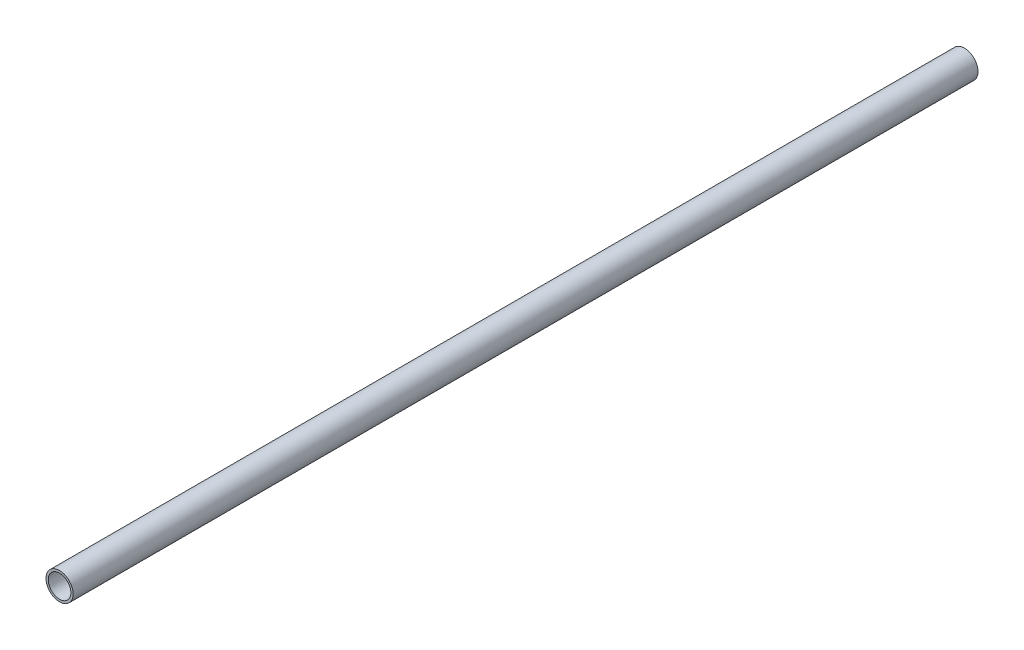
ISO-10303-21;
HEADER;
FILE_DESCRIPTION(('STEP AP214'),'2;1');
FILE_NAME('part.step','',(''),(''),'','','');
FILE_SCHEMA(('AUTOMOTIVE_DESIGN { 1 0 10303 214 1 1 1 1 }'));
ENDSEC;
DATA;
#1=APPLICATION_CONTEXT('core data for automotive mechanical design processes');
#2=APPLICATION_PROTOCOL_DEFINITION('international standard','automotive_design',2000,#1);
#3=PRODUCT_CONTEXT('',#1,'mechanical');
#4=PRODUCT('Part','Part','',(#3));
#5=PRODUCT_RELATED_PRODUCT_CATEGORY('part','',(#4));
#6=PRODUCT_DEFINITION_FORMATION('','',#4);
#7=PRODUCT_DEFINITION_CONTEXT('part definition',#1,'design');
#8=PRODUCT_DEFINITION('design','',#6,#7);
#9=PRODUCT_DEFINITION_SHAPE('','',#8);
#10=(LENGTH_UNIT() NAMED_UNIT(*) SI_UNIT(.MILLI.,.METRE.));
#11=(NAMED_UNIT(*) PLANE_ANGLE_UNIT() SI_UNIT($,.RADIAN.));
#12=(NAMED_UNIT(*) SI_UNIT($,.STERADIAN.) SOLID_ANGLE_UNIT());
#13=UNCERTAINTY_MEASURE_WITH_UNIT(LENGTH_MEASURE(1.E-05),#10,'distance_accuracy_value','');
#14=(GEOMETRIC_REPRESENTATION_CONTEXT(3) GLOBAL_UNCERTAINTY_ASSIGNED_CONTEXT((#13)) GLOBAL_UNIT_ASSIGNED_CONTEXT((#10,
#11,#12)) REPRESENTATION_CONTEXT('',''));
#15=CARTESIAN_POINT('',(0.,0.,0.));
#16=DIRECTION('',(0.,0.,1.));
#17=DIRECTION('',(1.,0.,0.));
#18=AXIS2_PLACEMENT_3D('',#15,#16,#17);
#19=CARTESIAN_POINT('',(0.,0.,400.));
#20=DIRECTION('',(0.,0.,1.));
#21=DIRECTION('',(1.,0.,0.));
#22=AXIS2_PLACEMENT_3D('',#19,#20,#21);
#23=PLANE('',#22);
#24=CARTESIAN_POINT('',(0.,0.,400.));
#25=DIRECTION('',(0.,0.,1.));
#26=DIRECTION('',(1.,0.,0.));
#27=AXIS2_PLACEMENT_3D('',#24,#25,#26);
#28=CIRCLE('',#27,6.);
#29=CARTESIAN_POINT('',(6.,0.,400.));
#30=VERTEX_POINT('',#29);
#31=EDGE_CURVE('E10',#30,#30,#28,.T.);
#32=ORIENTED_EDGE('',*,*,#31,.T.);
#33=EDGE_LOOP('',(#32));
#34=FACE_BOUND('',#33,.T.);
#35=CARTESIAN_POINT('',(0.,0.,400.));
#36=DIRECTION('',(0.,0.,1.));
#37=DIRECTION('',(1.,0.,0.));
#38=AXIS2_PLACEMENT_3D('',#35,#36,#37);
#39=CIRCLE('',#38,5.);
#40=CARTESIAN_POINT('',(5.,0.,400.));
#41=VERTEX_POINT('',#40);
#42=EDGE_CURVE('E60',#41,#41,#39,.T.);
#43=ORIENTED_EDGE('',*,*,#42,.F.);
#44=EDGE_LOOP('',(#43));
#45=FACE_BOUND('',#44,.T.);
#46=ADVANCED_FACE('F47',(#34,#45),#23,.T.);
#47=CARTESIAN_POINT('',(0.,0.,0.));
#48=DIRECTION('',(0.,0.,1.));
#49=DIRECTION('',(1.,0.,0.));
#50=AXIS2_PLACEMENT_3D('',#47,#48,#49);
#51=PLANE('',#50);
#52=CARTESIAN_POINT('',(0.,0.,0.));
#53=DIRECTION('',(0.,0.,1.));
#54=DIRECTION('',(1.,0.,0.));
#55=AXIS2_PLACEMENT_3D('',#52,#53,#54);
#56=CIRCLE('',#55,6.);
#57=CARTESIAN_POINT('',(6.,0.,0.));
#58=VERTEX_POINT('',#57);
#59=EDGE_CURVE('E51',#58,#58,#56,.T.);
#60=ORIENTED_EDGE('',*,*,#59,.F.);
#61=EDGE_LOOP('',(#60));
#62=FACE_BOUND('',#61,.T.);
#63=CARTESIAN_POINT('',(0.,0.,0.));
#64=DIRECTION('',(0.,0.,1.));
#65=DIRECTION('',(1.,0.,0.));
#66=AXIS2_PLACEMENT_3D('',#63,#64,#65);
#67=CIRCLE('',#66,5.);
#68=CARTESIAN_POINT('',(5.,0.,0.));
#69=VERTEX_POINT('',#68);
#70=EDGE_CURVE('E62',#69,#69,#67,.T.);
#71=ORIENTED_EDGE('',*,*,#70,.T.);
#72=EDGE_LOOP('',(#71));
#73=FACE_BOUND('',#72,.T.);
#74=ADVANCED_FACE('F74',(#62,#73),#51,.F.);
#75=CARTESIAN_POINT('',(0.,0.,400.));
#76=DIRECTION('',(0.,0.,-1.));
#77=DIRECTION('',(-1.,0.,0.));
#78=AXIS2_PLACEMENT_3D('',#75,#76,#77);
#79=CYLINDRICAL_SURFACE('',#78,6.);
#80=ORIENTED_EDGE('',*,*,#31,.F.);
#81=EDGE_LOOP('',(#80));
#82=FACE_BOUND('',#81,.T.);
#83=ORIENTED_EDGE('',*,*,#59,.T.);
#84=EDGE_LOOP('',(#83));
#85=FACE_BOUND('',#84,.T.);
#86=ADVANCED_FACE('F49',(#82,#85),#79,.T.);
#87=CARTESIAN_POINT('',(0.,0.,400.));
#88=DIRECTION('',(0.,0.,-1.));
#89=DIRECTION('',(-1.,0.,0.));
#90=AXIS2_PLACEMENT_3D('',#87,#88,#89);
#91=CYLINDRICAL_SURFACE('',#90,5.);
#92=ORIENTED_EDGE('',*,*,#42,.T.);
#93=EDGE_LOOP('',(#92));
#94=FACE_BOUND('',#93,.T.);
#95=ORIENTED_EDGE('',*,*,#70,.F.);
#96=EDGE_LOOP('',(#95));
#97=FACE_BOUND('',#96,.T.);
#98=ADVANCED_FACE('F70',(#94,#97),#91,.F.);
#99=CLOSED_SHELL('',(#46,#74,#86,#98));
#100=MANIFOLD_SOLID_BREP('B2',#99);
#101=ADVANCED_BREP_SHAPE_REPRESENTATION('',(#18,#100),#14);
#102=SHAPE_DEFINITION_REPRESENTATION(#9,#101);
ENDSEC;
END-ISO-10303-21;
